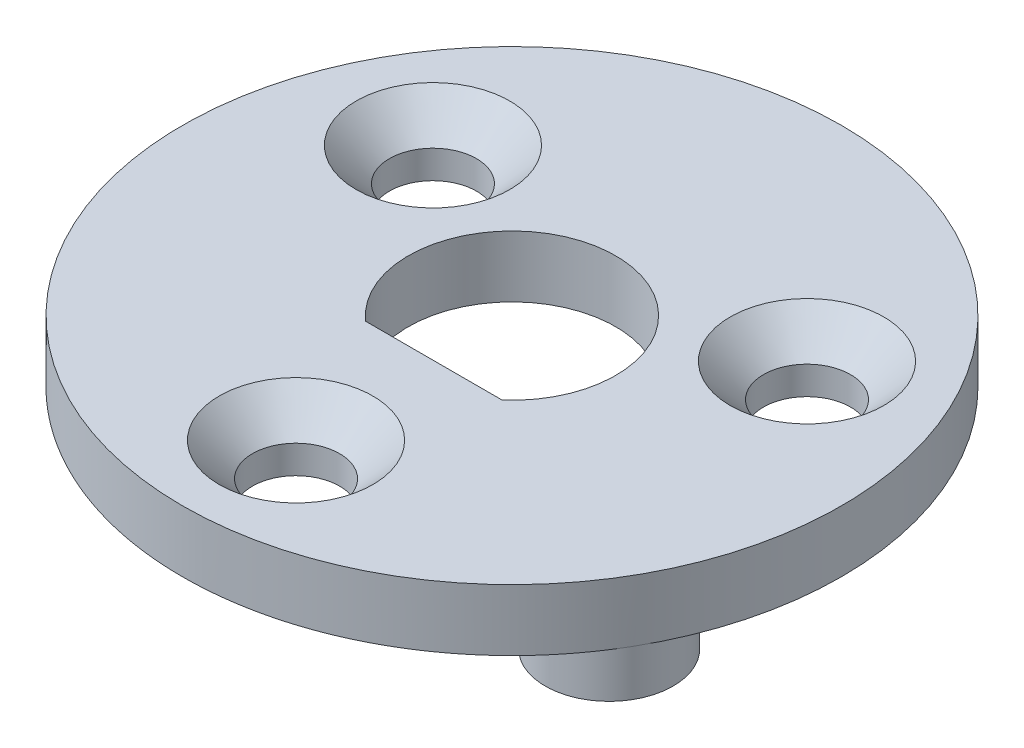
ISO-10303-21;
HEADER;
FILE_DESCRIPTION(('STEP AP214'),'2;1');
FILE_NAME('part.step','',(''),(''),'','','');
FILE_SCHEMA(('AUTOMOTIVE_DESIGN { 1 0 10303 214 1 1 1 1 }'));
ENDSEC;
DATA;
#1=APPLICATION_CONTEXT('core data for automotive mechanical design processes');
#2=APPLICATION_PROTOCOL_DEFINITION('international standard','automotive_design',2000,#1);
#3=PRODUCT_CONTEXT('',#1,'mechanical');
#4=PRODUCT('Part','Part','',(#3));
#5=PRODUCT_RELATED_PRODUCT_CATEGORY('part','',(#4));
#6=PRODUCT_DEFINITION_FORMATION('','',#4);
#7=PRODUCT_DEFINITION_CONTEXT('part definition',#1,'design');
#8=PRODUCT_DEFINITION('design','',#6,#7);
#9=PRODUCT_DEFINITION_SHAPE('','',#8);
#10=(LENGTH_UNIT() NAMED_UNIT(*) SI_UNIT(.MILLI.,.METRE.));
#11=(NAMED_UNIT(*) PLANE_ANGLE_UNIT() SI_UNIT($,.RADIAN.));
#12=(NAMED_UNIT(*) SI_UNIT($,.STERADIAN.) SOLID_ANGLE_UNIT());
#13=UNCERTAINTY_MEASURE_WITH_UNIT(LENGTH_MEASURE(1.E-05),#10,'distance_accuracy_value','');
#14=(GEOMETRIC_REPRESENTATION_CONTEXT(3) GLOBAL_UNCERTAINTY_ASSIGNED_CONTEXT((#13)) GLOBAL_UNIT_ASSIGNED_CONTEXT((#10,
#11,#12)) REPRESENTATION_CONTEXT('',''));
#15=CARTESIAN_POINT('',(0.,0.,0.));
#16=DIRECTION('',(0.,0.,1.));
#17=DIRECTION('',(1.,0.,0.));
#18=AXIS2_PLACEMENT_3D('',#15,#16,#17);
#19=CARTESIAN_POINT('',(0.,4.7,0.));
#20=DIRECTION('',(0.,1.,0.));
#21=DIRECTION('',(0.,0.,1.));
#22=AXIS2_PLACEMENT_3D('',#19,#20,#21);
#23=PLANE('',#22);
#24=CARTESIAN_POINT('',(-3.65246214046086,4.7,-2.10875000000002));
#25=DIRECTION('',(0.,1.,0.));
#26=DIRECTION('',(0.,0.,1.));
#27=AXIS2_PLACEMENT_3D('',#24,#25,#26);
#28=CIRCLE('',#27,1.49999954);
#29=CARTESIAN_POINT('',(-3.65246214046086,4.7,-0.608750460000016));
#30=VERTEX_POINT('',#29);
#31=EDGE_CURVE('E290',#30,#30,#28,.T.);
#32=ORIENTED_EDGE('',*,*,#31,.F.);
#33=EDGE_LOOP('',(#32));
#34=FACE_BOUND('',#33,.T.);
#35=CARTESIAN_POINT('',(3.65246214046086,4.7,-2.10875000000002));
#36=DIRECTION('',(0.,1.,0.));
#37=DIRECTION('',(0.,0.,1.));
#38=AXIS2_PLACEMENT_3D('',#35,#36,#37);
#39=CIRCLE('',#38,1.49999954);
#40=CARTESIAN_POINT('',(3.65246214046086,4.7,-0.608750460000018));
#41=VERTEX_POINT('',#40);
#42=EDGE_CURVE('E150',#41,#41,#39,.T.);
#43=ORIENTED_EDGE('',*,*,#42,.F.);
#44=EDGE_LOOP('',(#43));
#45=FACE_BOUND('',#44,.T.);
#46=CARTESIAN_POINT('',(0.,4.7,4.2175));
#47=DIRECTION('',(0.,1.,0.));
#48=DIRECTION('',(0.,0.,1.));
#49=AXIS2_PLACEMENT_3D('',#46,#47,#48);
#50=CIRCLE('',#49,1.49999954);
#51=CARTESIAN_POINT('',(0.,4.7,5.71749954));
#52=VERTEX_POINT('',#51);
#53=EDGE_CURVE('E143',#52,#52,#50,.T.);
#54=ORIENTED_EDGE('',*,*,#53,.F.);
#55=EDGE_LOOP('',(#54));
#56=FACE_BOUND('',#55,.T.);
#57=CARTESIAN_POINT('',(0.,4.7,0.));
#58=DIRECTION('',(0.,1.,0.));
#59=DIRECTION('',(0.,0.,1.));
#60=AXIS2_PLACEMENT_3D('',#57,#58,#59);
#61=CIRCLE('',#60,6.435);
#62=CARTESIAN_POINT('',(0.,4.7,6.435));
#63=VERTEX_POINT('',#62);
#64=EDGE_CURVE('E132',#63,#63,#61,.T.);
#65=ORIENTED_EDGE('',*,*,#64,.T.);
#66=EDGE_LOOP('',(#65));
#67=FACE_BOUND('',#66,.T.);
#68=CARTESIAN_POINT('',(0.,4.7,0.));
#69=DIRECTION('',(0.,1.,0.));
#70=DIRECTION('',(0.,0.,1.));
#71=AXIS2_PLACEMENT_3D('',#68,#69,#70);
#72=CIRCLE('',#71,2.025);
#73=CARTESIAN_POINT('',(1.33229125944742,4.7,1.525));
#74=VERTEX_POINT('',#73);
#75=CARTESIAN_POINT('',(-1.33229125944742,4.7,1.525));
#76=VERTEX_POINT('',#75);
#77=EDGE_CURVE('E81',#74,#76,#72,.T.);
#78=ORIENTED_EDGE('',*,*,#77,.F.);
#79=DIRECTION('',(-1.,0.,0.));
#80=VECTOR('',#79,1.);
#81=CARTESIAN_POINT('',(0.,4.7,1.525));
#82=LINE('',#81,#80);
#83=EDGE_CURVE('E85',#74,#76,#82,.T.);
#84=ORIENTED_EDGE('',*,*,#83,.T.);
#85=EDGE_LOOP('',(#78,#84));
#86=FACE_BOUND('',#85,.T.);
#87=ADVANCED_FACE('F45',(#34,#45,#56,#67,#86),#23,.T.);
#88=CARTESIAN_POINT('',(0.,3.5,0.));
#89=DIRECTION('',(0.,1.,0.));
#90=DIRECTION('',(0.,0.,1.));
#91=AXIS2_PLACEMENT_3D('',#88,#89,#90);
#92=PLANE('',#91);
#93=CARTESIAN_POINT('',(-3.65246214046086,3.5,-2.10875000000002));
#94=DIRECTION('',(0.,1.,0.));
#95=DIRECTION('',(0.,0.,1.));
#96=AXIS2_PLACEMENT_3D('',#93,#94,#95);
#97=CIRCLE('',#96,0.849999950999999);
#98=CARTESIAN_POINT('',(-3.65246214046086,3.5,-1.25875004900002));
#99=VERTEX_POINT('',#98);
#100=EDGE_CURVE('E49',#99,#99,#97,.T.);
#101=ORIENTED_EDGE('',*,*,#100,.T.);
#102=EDGE_LOOP('',(#101));
#103=FACE_BOUND('',#102,.T.);
#104=CARTESIAN_POINT('',(3.65246214046086,3.5,-2.10875000000002));
#105=DIRECTION('',(0.,1.,0.));
#106=DIRECTION('',(0.,0.,1.));
#107=AXIS2_PLACEMENT_3D('',#104,#105,#106);
#108=CIRCLE('',#107,0.849999950999999);
#109=CARTESIAN_POINT('',(3.65246214046086,3.5,-1.25875004900002));
#110=VERTEX_POINT('',#109);
#111=EDGE_CURVE('E141',#110,#110,#108,.T.);
#112=ORIENTED_EDGE('',*,*,#111,.T.);
#113=EDGE_LOOP('',(#112));
#114=FACE_BOUND('',#113,.T.);
#115=CARTESIAN_POINT('',(0.,3.5,4.2175));
#116=DIRECTION('',(0.,1.,0.));
#117=DIRECTION('',(0.,0.,1.));
#118=AXIS2_PLACEMENT_3D('',#115,#116,#117);
#119=CIRCLE('',#118,0.849999950999999);
#120=CARTESIAN_POINT('',(0.,3.5,5.067499951));
#121=VERTEX_POINT('',#120);
#122=EDGE_CURVE('E91',#121,#121,#119,.T.);
#123=ORIENTED_EDGE('',*,*,#122,.T.);
#124=EDGE_LOOP('',(#123));
#125=FACE_BOUND('',#124,.T.);
#126=CARTESIAN_POINT('',(0.,3.5,0.));
#127=DIRECTION('',(0.,1.,0.));
#128=DIRECTION('',(0.,0.,1.));
#129=AXIS2_PLACEMENT_3D('',#126,#127,#128);
#130=CIRCLE('',#129,6.435);
#131=CARTESIAN_POINT('',(0.,3.5,-6.435));
#132=VERTEX_POINT('',#131);
#133=CARTESIAN_POINT('',(-5.57287347335285,3.5,3.21750000000003));
#134=VERTEX_POINT('',#133);
#135=EDGE_CURVE('E137',#132,#134,#130,.T.);
#136=ORIENTED_EDGE('',*,*,#135,.F.);
#137=CARTESIAN_POINT('',(0.,3.5,-5.185));
#138=DIRECTION('',(0.,-1.,0.));
#139=DIRECTION('',(0.,0.,-1.));
#140=AXIS2_PLACEMENT_3D('',#137,#138,#139);
#141=CIRCLE('',#140,1.25);
#142=EDGE_CURVE('E103',#132,#132,#141,.T.);
#143=ORIENTED_EDGE('',*,*,#142,.F.);
#144=CARTESIAN_POINT('',(5.57287347335285,3.5,3.21750000000003));
#145=VERTEX_POINT('',#144);
#146=EDGE_CURVE('E135',#145,#132,#130,.T.);
#147=ORIENTED_EDGE('',*,*,#146,.F.);
#148=CARTESIAN_POINT('',(4.4903417186223,3.5,2.59250000000002));
#149=DIRECTION('',(0.,-1.,0.));
#150=DIRECTION('',(0.,0.,-1.));
#151=AXIS2_PLACEMENT_3D('',#148,#149,#150);
#152=CIRCLE('',#151,1.25);
#153=EDGE_CURVE('E96',#145,#145,#152,.T.);
#154=ORIENTED_EDGE('',*,*,#153,.F.);
#155=EDGE_CURVE('E106',#134,#145,#130,.T.);
#156=ORIENTED_EDGE('',*,*,#155,.F.);
#157=CARTESIAN_POINT('',(-4.4903417186223,3.5,2.59250000000002));
#158=DIRECTION('',(0.,-1.,0.));
#159=DIRECTION('',(0.,0.,-1.));
#160=AXIS2_PLACEMENT_3D('',#157,#158,#159);
#161=CIRCLE('',#160,1.25);
#162=EDGE_CURVE('E116',#134,#134,#161,.T.);
#163=ORIENTED_EDGE('',*,*,#162,.F.);
#164=EDGE_LOOP('',(#136,#143,#147,#154,#156,#163));
#165=FACE_BOUND('',#164,.T.);
#166=DIRECTION('',(-1.,0.,0.));
#167=VECTOR('',#166,1.);
#168=CARTESIAN_POINT('',(0.,3.5,1.525));
#169=LINE('',#168,#167);
#170=CARTESIAN_POINT('',(1.33229125944742,3.5,1.525));
#171=VERTEX_POINT('',#170);
#172=CARTESIAN_POINT('',(-1.33229125944742,3.5,1.525));
#173=VERTEX_POINT('',#172);
#174=EDGE_CURVE('E11',#171,#173,#169,.T.);
#175=ORIENTED_EDGE('',*,*,#174,.F.);
#176=CARTESIAN_POINT('',(0.,3.5,0.));
#177=DIRECTION('',(0.,1.,0.));
#178=DIRECTION('',(0.,0.,1.));
#179=AXIS2_PLACEMENT_3D('',#176,#177,#178);
#180=CIRCLE('',#179,2.025);
#181=EDGE_CURVE('E54',#171,#173,#180,.T.);
#182=ORIENTED_EDGE('',*,*,#181,.T.);
#183=EDGE_LOOP('',(#175,#182));
#184=FACE_BOUND('',#183,.T.);
#185=ADVANCED_FACE('F161',(#103,#114,#125,#165,#184),#92,.F.);
#186=CARTESIAN_POINT('',(0.,4.7,0.));
#187=DIRECTION('',(0.,-1.,0.));
#188=DIRECTION('',(0.,0.,-1.));
#189=AXIS2_PLACEMENT_3D('',#186,#187,#188);
#190=CYLINDRICAL_SURFACE('',#189,6.435);
#191=ORIENTED_EDGE('',*,*,#64,.F.);
#192=EDGE_LOOP('',(#191));
#193=FACE_BOUND('',#192,.T.);
#194=ORIENTED_EDGE('',*,*,#146,.T.);
#195=ORIENTED_EDGE('',*,*,#135,.T.);
#196=ORIENTED_EDGE('',*,*,#155,.T.);
#197=EDGE_LOOP('',(#194,#195,#196));
#198=FACE_BOUND('',#197,.T.);
#199=ADVANCED_FACE('F47',(#193,#198),#190,.T.);
#200=CARTESIAN_POINT('',(4.4903417186223,2.6,2.59250000000002));
#201=DIRECTION('',(0.,1.,0.));
#202=DIRECTION('',(0.,0.,1.));
#203=AXIS2_PLACEMENT_3D('',#200,#201,#202);
#204=CYLINDRICAL_SURFACE('',#203,0.6);
#205=CARTESIAN_POINT('',(4.4903417186223,2.6,2.59250000000002));
#206=DIRECTION('',(0.,-1.,0.));
#207=DIRECTION('',(0.,0.,-1.));
#208=AXIS2_PLACEMENT_3D('',#205,#206,#207);
#209=CIRCLE('',#208,0.6);
#210=CARTESIAN_POINT('',(4.4903417186223,2.6,1.99250000000002));
#211=VERTEX_POINT('',#210);
#212=EDGE_CURVE('E125',#211,#211,#209,.T.);
#213=ORIENTED_EDGE('',*,*,#212,.T.);
#214=EDGE_LOOP('',(#213));
#215=FACE_BOUND('',#214,.T.);
#216=CARTESIAN_POINT('',(4.4903417186223,3.5,2.59250000000002));
#217=DIRECTION('',(0.,-1.,0.));
#218=DIRECTION('',(0.,0.,-1.));
#219=AXIS2_PLACEMENT_3D('',#216,#217,#218);
#220=CIRCLE('',#219,0.6);
#221=CARTESIAN_POINT('',(4.4903417186223,3.5,1.99250000000002));
#222=VERTEX_POINT('',#221);
#223=EDGE_CURVE('E93',#222,#222,#220,.T.);
#224=ORIENTED_EDGE('',*,*,#223,.F.);
#225=EDGE_LOOP('',(#224));
#226=FACE_BOUND('',#225,.T.);
#227=ADVANCED_FACE('F171',(#215,#226),#204,.F.);
#228=CARTESIAN_POINT('',(4.4903417186223,2.6,2.59250000000002));
#229=DIRECTION('',(0.,1.,0.));
#230=DIRECTION('',(0.,0.,1.));
#231=AXIS2_PLACEMENT_3D('',#228,#229,#230);
#232=CYLINDRICAL_SURFACE('',#231,1.25);
#233=CARTESIAN_POINT('',(4.4903417186223,2.6,2.59250000000002));
#234=DIRECTION('',(0.,-1.,0.));
#235=DIRECTION('',(0.,0.,-1.));
#236=AXIS2_PLACEMENT_3D('',#233,#234,#235);
#237=CIRCLE('',#236,1.25);
#238=CARTESIAN_POINT('',(4.4903417186223,2.6,1.34250000000002));
#239=VERTEX_POINT('',#238);
#240=EDGE_CURVE('E122',#239,#239,#237,.T.);
#241=ORIENTED_EDGE('',*,*,#240,.F.);
#242=EDGE_LOOP('',(#241));
#243=FACE_BOUND('',#242,.T.);
#244=ORIENTED_EDGE('',*,*,#153,.T.);
#245=EDGE_LOOP('',(#244));
#246=FACE_BOUND('',#245,.T.);
#247=ADVANCED_FACE('F192',(#243,#246),#232,.T.);
#248=CARTESIAN_POINT('',(0.,2.6,0.));
#249=DIRECTION('',(0.,-1.,0.));
#250=DIRECTION('',(0.,0.,-1.));
#251=AXIS2_PLACEMENT_3D('',#248,#249,#250);
#252=PLANE('',#251);
#253=ORIENTED_EDGE('',*,*,#212,.F.);
#254=EDGE_LOOP('',(#253));
#255=FACE_BOUND('',#254,.T.);
#256=ORIENTED_EDGE('',*,*,#240,.T.);
#257=EDGE_LOOP('',(#256));
#258=FACE_BOUND('',#257,.T.);
#259=ADVANCED_FACE('F182',(#255,#258),#252,.T.);
#260=ORIENTED_EDGE('',*,*,#223,.T.);
#261=EDGE_LOOP('',(#260));
#262=FACE_BOUND('',#261,.T.);
#263=ADVANCED_FACE('F165',(#262),#92,.F.);
#264=CARTESIAN_POINT('',(-4.4903417186223,2.6,2.59250000000002));
#265=DIRECTION('',(0.,1.,0.));
#266=DIRECTION('',(0.,0.,1.));
#267=AXIS2_PLACEMENT_3D('',#264,#265,#266);
#268=CYLINDRICAL_SURFACE('',#267,0.6);
#269=CARTESIAN_POINT('',(-4.4903417186223,2.6,2.59250000000002));
#270=DIRECTION('',(0.,-1.,0.));
#271=DIRECTION('',(0.,0.,-1.));
#272=AXIS2_PLACEMENT_3D('',#269,#270,#271);
#273=CIRCLE('',#272,0.6);
#274=CARTESIAN_POINT('',(-4.4903417186223,2.6,1.99250000000002));
#275=VERTEX_POINT('',#274);
#276=EDGE_CURVE('E113',#275,#275,#273,.T.);
#277=ORIENTED_EDGE('',*,*,#276,.T.);
#278=EDGE_LOOP('',(#277));
#279=FACE_BOUND('',#278,.T.);
#280=CARTESIAN_POINT('',(-4.4903417186223,3.5,2.59250000000002));
#281=DIRECTION('',(0.,-1.,0.));
#282=DIRECTION('',(0.,0.,-1.));
#283=AXIS2_PLACEMENT_3D('',#280,#281,#282);
#284=CIRCLE('',#283,0.6);
#285=CARTESIAN_POINT('',(-4.4903417186223,3.5,1.99250000000002));
#286=VERTEX_POINT('',#285);
#287=EDGE_CURVE('E119',#286,#286,#284,.T.);
#288=ORIENTED_EDGE('',*,*,#287,.F.);
#289=EDGE_LOOP('',(#288));
#290=FACE_BOUND('',#289,.T.);
#291=ADVANCED_FACE('F181',(#279,#290),#268,.F.);
#292=CARTESIAN_POINT('',(-4.4903417186223,2.6,2.59250000000002));
#293=DIRECTION('',(0.,1.,0.));
#294=DIRECTION('',(0.,0.,1.));
#295=AXIS2_PLACEMENT_3D('',#292,#293,#294);
#296=CYLINDRICAL_SURFACE('',#295,1.25);
#297=CARTESIAN_POINT('',(-4.4903417186223,2.6,2.59250000000002));
#298=DIRECTION('',(0.,-1.,0.));
#299=DIRECTION('',(0.,0.,-1.));
#300=AXIS2_PLACEMENT_3D('',#297,#298,#299);
#301=CIRCLE('',#300,1.25);
#302=CARTESIAN_POINT('',(-4.4903417186223,2.6,1.34250000000002));
#303=VERTEX_POINT('',#302);
#304=EDGE_CURVE('E110',#303,#303,#301,.T.);
#305=ORIENTED_EDGE('',*,*,#304,.F.);
#306=EDGE_LOOP('',(#305));
#307=FACE_BOUND('',#306,.T.);
#308=ORIENTED_EDGE('',*,*,#162,.T.);
#309=EDGE_LOOP('',(#308));
#310=FACE_BOUND('',#309,.T.);
#311=ADVANCED_FACE('F189',(#307,#310),#296,.T.);
#312=CARTESIAN_POINT('',(0.,2.6,0.));
#313=DIRECTION('',(0.,-1.,0.));
#314=DIRECTION('',(0.,0.,-1.));
#315=AXIS2_PLACEMENT_3D('',#312,#313,#314);
#316=PLANE('',#315);
#317=ORIENTED_EDGE('',*,*,#276,.F.);
#318=EDGE_LOOP('',(#317));
#319=FACE_BOUND('',#318,.T.);
#320=ORIENTED_EDGE('',*,*,#304,.T.);
#321=EDGE_LOOP('',(#320));
#322=FACE_BOUND('',#321,.T.);
#323=ADVANCED_FACE('F197',(#319,#322),#316,.T.);
#324=ORIENTED_EDGE('',*,*,#287,.T.);
#325=EDGE_LOOP('',(#324));
#326=FACE_BOUND('',#325,.T.);
#327=ADVANCED_FACE('F179',(#326),#92,.F.);
#328=CARTESIAN_POINT('',(0.,2.6,-5.185));
#329=DIRECTION('',(0.,1.,0.));
#330=DIRECTION('',(0.,0.,1.));
#331=AXIS2_PLACEMENT_3D('',#328,#329,#330);
#332=CYLINDRICAL_SURFACE('',#331,0.6);
#333=CARTESIAN_POINT('',(0.,2.6,-5.185));
#334=DIRECTION('',(0.,-1.,0.));
#335=DIRECTION('',(0.,0.,-1.));
#336=AXIS2_PLACEMENT_3D('',#333,#334,#335);
#337=CIRCLE('',#336,0.6);
#338=CARTESIAN_POINT('',(0.,2.6,-5.785));
#339=VERTEX_POINT('',#338);
#340=EDGE_CURVE('E99',#339,#339,#337,.T.);
#341=ORIENTED_EDGE('',*,*,#340,.T.);
#342=EDGE_LOOP('',(#341));
#343=FACE_BOUND('',#342,.T.);
#344=CARTESIAN_POINT('',(0.,3.5,-5.185));
#345=DIRECTION('',(0.,-1.,0.));
#346=DIRECTION('',(0.,0.,-1.));
#347=AXIS2_PLACEMENT_3D('',#344,#345,#346);
#348=CIRCLE('',#347,0.6);
#349=CARTESIAN_POINT('',(0.,3.5,-5.785));
#350=VERTEX_POINT('',#349);
#351=EDGE_CURVE('E107',#350,#350,#348,.T.);
#352=ORIENTED_EDGE('',*,*,#351,.F.);
#353=EDGE_LOOP('',(#352));
#354=FACE_BOUND('',#353,.T.);
#355=ADVANCED_FACE('F196',(#343,#354),#332,.F.);
#356=CARTESIAN_POINT('',(0.,2.6,-5.185));
#357=DIRECTION('',(0.,1.,0.));
#358=DIRECTION('',(0.,0.,1.));
#359=AXIS2_PLACEMENT_3D('',#356,#357,#358);
#360=CYLINDRICAL_SURFACE('',#359,1.25);
#361=CARTESIAN_POINT('',(0.,2.6,-5.185));
#362=DIRECTION('',(0.,-1.,0.));
#363=DIRECTION('',(0.,0.,-1.));
#364=AXIS2_PLACEMENT_3D('',#361,#362,#363);
#365=CIRCLE('',#364,1.25);
#366=CARTESIAN_POINT('',(0.,2.6,-6.435));
#367=VERTEX_POINT('',#366);
#368=EDGE_CURVE('E102',#367,#367,#365,.T.);
#369=ORIENTED_EDGE('',*,*,#368,.F.);
#370=EDGE_LOOP('',(#369));
#371=FACE_BOUND('',#370,.T.);
#372=ORIENTED_EDGE('',*,*,#142,.T.);
#373=EDGE_LOOP('',(#372));
#374=FACE_BOUND('',#373,.T.);
#375=ADVANCED_FACE('F204',(#371,#374),#360,.T.);
#376=CARTESIAN_POINT('',(0.,2.6,0.));
#377=DIRECTION('',(0.,-1.,0.));
#378=DIRECTION('',(0.,0.,-1.));
#379=AXIS2_PLACEMENT_3D('',#376,#377,#378);
#380=PLANE('',#379);
#381=ORIENTED_EDGE('',*,*,#340,.F.);
#382=EDGE_LOOP('',(#381));
#383=FACE_BOUND('',#382,.T.);
#384=ORIENTED_EDGE('',*,*,#368,.T.);
#385=EDGE_LOOP('',(#384));
#386=FACE_BOUND('',#385,.T.);
#387=ADVANCED_FACE('F177',(#383,#386),#380,.T.);
#388=ORIENTED_EDGE('',*,*,#351,.T.);
#389=EDGE_LOOP('',(#388));
#390=FACE_BOUND('',#389,.T.);
#391=ADVANCED_FACE('F164',(#390),#92,.F.);
#392=CARTESIAN_POINT('',(0.,7.5,1.525));
#393=DIRECTION('',(0.,0.,-1.));
#394=DIRECTION('',(-1.,0.,0.));
#395=AXIS2_PLACEMENT_3D('',#392,#393,#394);
#396=PLANE('',#395);
#397=DIRECTION('',(0.,-1.,0.));
#398=VECTOR('',#397,1.);
#399=CARTESIAN_POINT('',(1.33229125944742,7.5,1.525));
#400=LINE('',#399,#398);
#401=EDGE_CURVE('E62',#74,#171,#400,.T.);
#402=ORIENTED_EDGE('',*,*,#401,.T.);
#403=ORIENTED_EDGE('',*,*,#174,.T.);
#404=DIRECTION('',(0.,-1.,0.));
#405=VECTOR('',#404,1.);
#406=CARTESIAN_POINT('',(-1.33229125944742,7.5,1.525));
#407=LINE('',#406,#405);
#408=EDGE_CURVE('E67',#76,#173,#407,.T.);
#409=ORIENTED_EDGE('',*,*,#408,.F.);
#410=ORIENTED_EDGE('',*,*,#83,.F.);
#411=EDGE_LOOP('',(#402,#403,#409,#410));
#412=FACE_BOUND('',#411,.T.);
#413=ADVANCED_FACE('F88',(#412),#396,.T.);
#414=CARTESIAN_POINT('',(0.,7.5,0.));
#415=DIRECTION('',(0.,-1.,0.));
#416=DIRECTION('',(0.,0.,-1.));
#417=AXIS2_PLACEMENT_3D('',#414,#415,#416);
#418=CYLINDRICAL_SURFACE('',#417,2.025);
#419=ORIENTED_EDGE('',*,*,#77,.T.);
#420=ORIENTED_EDGE('',*,*,#408,.T.);
#421=ORIENTED_EDGE('',*,*,#181,.F.);
#422=ORIENTED_EDGE('',*,*,#401,.F.);
#423=EDGE_LOOP('',(#419,#420,#421,#422));
#424=FACE_BOUND('',#423,.T.);
#425=ADVANCED_FACE('F82',(#424),#418,.F.);
#426=CARTESIAN_POINT('',(0.,4.7,4.2175));
#427=DIRECTION('',(0.,1.,0.));
#428=DIRECTION('',(0.,0.,1.));
#429=AXIS2_PLACEMENT_3D('',#426,#427,#428);
#430=CYLINDRICAL_SURFACE('',#429,0.849999950999999);
#431=CARTESIAN_POINT('',(0.,4.050000411,4.2175));
#432=DIRECTION('',(0.,1.,0.));
#433=DIRECTION('',(0.,0.,1.));
#434=AXIS2_PLACEMENT_3D('',#431,#432,#433);
#435=CIRCLE('',#434,0.849999950999999);
#436=CARTESIAN_POINT('',(0.,4.050000411,5.067499951));
#437=VERTEX_POINT('',#436);
#438=EDGE_CURVE('E140',#437,#437,#435,.T.);
#439=ORIENTED_EDGE('',*,*,#438,.T.);
#440=EDGE_LOOP('',(#439));
#441=FACE_BOUND('',#440,.T.);
#442=ORIENTED_EDGE('',*,*,#122,.F.);
#443=EDGE_LOOP('',(#442));
#444=FACE_BOUND('',#443,.T.);
#445=ADVANCED_FACE('F259',(#441,#444),#430,.F.);
#446=CARTESIAN_POINT('',(0.,4.7,4.2175));
#447=DIRECTION('',(0.,1.,0.));
#448=DIRECTION('',(0.,0.,1.));
#449=AXIS2_PLACEMENT_3D('',#446,#447,#448);
#450=CONICAL_SURFACE('',#449,1.49999954,0.78539816339745);
#451=ORIENTED_EDGE('',*,*,#438,.F.);
#452=EDGE_LOOP('',(#451));
#453=FACE_BOUND('',#452,.T.);
#454=ORIENTED_EDGE('',*,*,#53,.T.);
#455=EDGE_LOOP('',(#454));
#456=FACE_BOUND('',#455,.T.);
#457=ADVANCED_FACE('F262',(#453,#456),#450,.F.);
#458=CARTESIAN_POINT('',(3.65246214046086,4.7,-2.10875000000002));
#459=DIRECTION('',(0.,1.,0.));
#460=DIRECTION('',(0.,0.,1.));
#461=AXIS2_PLACEMENT_3D('',#458,#459,#460);
#462=CYLINDRICAL_SURFACE('',#461,0.849999950999999);
#463=CARTESIAN_POINT('',(3.65246214046086,4.050000411,-2.10875000000002));
#464=DIRECTION('',(0.,1.,0.));
#465=DIRECTION('',(0.,0.,1.));
#466=AXIS2_PLACEMENT_3D('',#463,#464,#465);
#467=CIRCLE('',#466,0.849999950999999);
#468=CARTESIAN_POINT('',(3.65246214046086,4.050000411,-1.25875004900002));
#469=VERTEX_POINT('',#468);
#470=EDGE_CURVE('E144',#469,#469,#467,.T.);
#471=ORIENTED_EDGE('',*,*,#470,.T.);
#472=EDGE_LOOP('',(#471));
#473=FACE_BOUND('',#472,.T.);
#474=ORIENTED_EDGE('',*,*,#111,.F.);
#475=EDGE_LOOP('',(#474));
#476=FACE_BOUND('',#475,.T.);
#477=ADVANCED_FACE('F266',(#473,#476),#462,.F.);
#478=CARTESIAN_POINT('',(3.65246214046086,4.7,-2.10875000000002));
#479=DIRECTION('',(0.,1.,0.));
#480=DIRECTION('',(0.,0.,1.));
#481=AXIS2_PLACEMENT_3D('',#478,#479,#480);
#482=CONICAL_SURFACE('',#481,1.49999954,0.78539816339745);
#483=ORIENTED_EDGE('',*,*,#470,.F.);
#484=EDGE_LOOP('',(#483));
#485=FACE_BOUND('',#484,.T.);
#486=ORIENTED_EDGE('',*,*,#42,.T.);
#487=EDGE_LOOP('',(#486));
#488=FACE_BOUND('',#487,.T.);
#489=ADVANCED_FACE('F270',(#485,#488),#482,.F.);
#490=CARTESIAN_POINT('',(-3.65246214046086,4.7,-2.10875000000002));
#491=DIRECTION('',(0.,1.,0.));
#492=DIRECTION('',(0.,0.,1.));
#493=AXIS2_PLACEMENT_3D('',#490,#491,#492);
#494=CYLINDRICAL_SURFACE('',#493,0.849999950999999);
#495=CARTESIAN_POINT('',(-3.65246214046086,4.050000411,-2.10875000000002));
#496=DIRECTION('',(0.,1.,0.));
#497=DIRECTION('',(0.,0.,1.));
#498=AXIS2_PLACEMENT_3D('',#495,#496,#497);
#499=CIRCLE('',#498,0.849999950999999);
#500=CARTESIAN_POINT('',(-3.65246214046086,4.050000411,-1.25875004900002));
#501=VERTEX_POINT('',#500);
#502=EDGE_CURVE('E287',#501,#501,#499,.T.);
#503=ORIENTED_EDGE('',*,*,#502,.T.);
#504=EDGE_LOOP('',(#503));
#505=FACE_BOUND('',#504,.T.);
#506=ORIENTED_EDGE('',*,*,#100,.F.);
#507=EDGE_LOOP('',(#506));
#508=FACE_BOUND('',#507,.T.);
#509=ADVANCED_FACE('F273',(#505,#508),#494,.F.);
#510=CARTESIAN_POINT('',(-3.65246214046086,4.7,-2.10875000000002));
#511=DIRECTION('',(0.,1.,0.));
#512=DIRECTION('',(0.,0.,1.));
#513=AXIS2_PLACEMENT_3D('',#510,#511,#512);
#514=CONICAL_SURFACE('',#513,1.49999954,0.785398163397449);
#515=ORIENTED_EDGE('',*,*,#502,.F.);
#516=EDGE_LOOP('',(#515));
#517=FACE_BOUND('',#516,.T.);
#518=ORIENTED_EDGE('',*,*,#31,.T.);
#519=EDGE_LOOP('',(#518));
#520=FACE_BOUND('',#519,.T.);
#521=ADVANCED_FACE('F277',(#517,#520),#514,.F.);
#522=CLOSED_SHELL('',(#87,#185,#199,#227,#247,#259,#263,#291,#311,#323,#327,#355,#375,#387,#391,
#413,#425,#445,#457,#477,#489,#509,#521));
#523=MANIFOLD_SOLID_BREP('B2',#522);
#524=ADVANCED_BREP_SHAPE_REPRESENTATION('',(#18,#523),#14);
#525=SHAPE_DEFINITION_REPRESENTATION(#9,#524);
ENDSEC;
END-ISO-10303-21;
